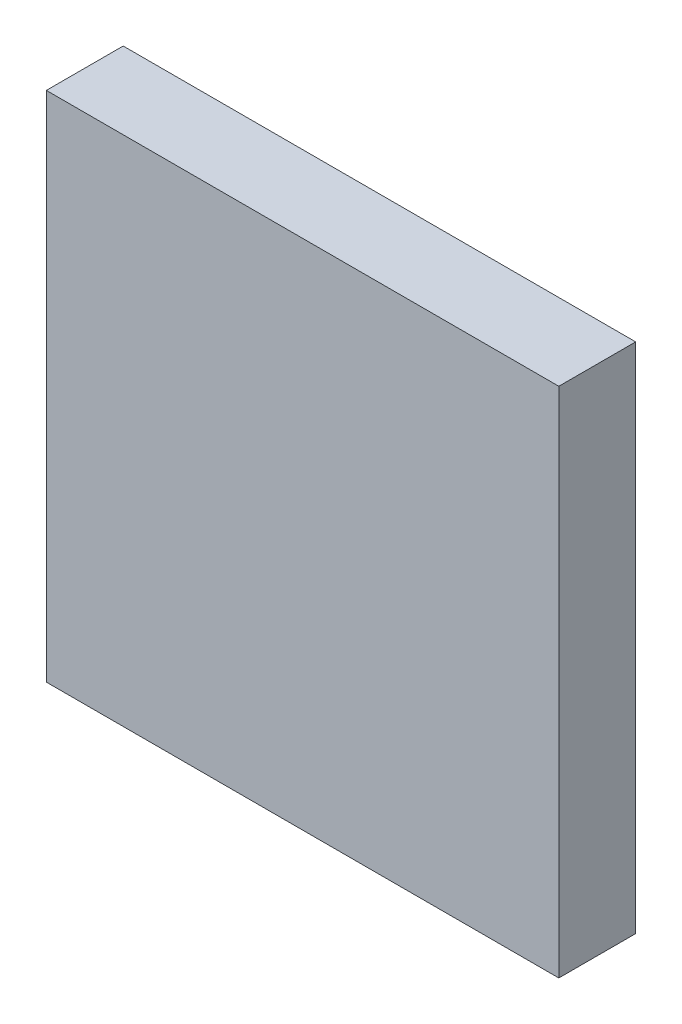
ISO-10303-21;
HEADER;
FILE_DESCRIPTION(('STEP AP214'),'2;1');
FILE_NAME('part.step','',(''),(''),'','','');
FILE_SCHEMA(('AUTOMOTIVE_DESIGN { 1 0 10303 214 1 1 1 1 }'));
ENDSEC;
DATA;
#1=APPLICATION_CONTEXT('core data for automotive mechanical design processes');
#2=APPLICATION_PROTOCOL_DEFINITION('international standard','automotive_design',2000,#1);
#3=PRODUCT_CONTEXT('',#1,'mechanical');
#4=PRODUCT('Part','Part','',(#3));
#5=PRODUCT_RELATED_PRODUCT_CATEGORY('part','',(#4));
#6=PRODUCT_DEFINITION_FORMATION('','',#4);
#7=PRODUCT_DEFINITION_CONTEXT('part definition',#1,'design');
#8=PRODUCT_DEFINITION('design','',#6,#7);
#9=PRODUCT_DEFINITION_SHAPE('','',#8);
#10=(LENGTH_UNIT() NAMED_UNIT(*) SI_UNIT(.MILLI.,.METRE.));
#11=(NAMED_UNIT(*) PLANE_ANGLE_UNIT() SI_UNIT($,.RADIAN.));
#12=(NAMED_UNIT(*) SI_UNIT($,.STERADIAN.) SOLID_ANGLE_UNIT());
#13=UNCERTAINTY_MEASURE_WITH_UNIT(LENGTH_MEASURE(1.E-05),#10,'distance_accuracy_value','');
#14=(GEOMETRIC_REPRESENTATION_CONTEXT(3) GLOBAL_UNCERTAINTY_ASSIGNED_CONTEXT((#13)) GLOBAL_UNIT_ASSIGNED_CONTEXT((#10,
#11,#12)) REPRESENTATION_CONTEXT('',''));
#15=CARTESIAN_POINT('',(0.,0.,0.));
#16=DIRECTION('',(0.,0.,1.));
#17=DIRECTION('',(1.,0.,0.));
#18=AXIS2_PLACEMENT_3D('',#15,#16,#17);
#19=CARTESIAN_POINT('',(0.,0.,6.));
#20=DIRECTION('',(1.,0.,0.));
#21=DIRECTION('',(0.,0.,-1.));
#22=AXIS2_PLACEMENT_3D('',#19,#20,#21);
#23=PLANE('',#22);
#24=DIRECTION('',(0.,-1.,0.));
#25=VECTOR('',#24,1.);
#26=CARTESIAN_POINT('',(0.,0.,0.));
#27=LINE('',#26,#25);
#28=CARTESIAN_POINT('',(0.,40.,0.));
#29=VERTEX_POINT('',#28);
#30=CARTESIAN_POINT('',(0.,0.,0.));
#31=VERTEX_POINT('',#30);
#32=EDGE_CURVE('E100',#29,#31,#27,.T.);
#33=ORIENTED_EDGE('',*,*,#32,.T.);
#34=DIRECTION('',(0.,0.,-1.));
#35=VECTOR('',#34,1.);
#36=CARTESIAN_POINT('',(0.,0.,6.));
#37=LINE('',#36,#35);
#38=CARTESIAN_POINT('',(0.,0.,6.));
#39=VERTEX_POINT('',#38);
#40=EDGE_CURVE('E11',#39,#31,#37,.T.);
#41=ORIENTED_EDGE('',*,*,#40,.F.);
#42=DIRECTION('',(0.,-1.,0.));
#43=VECTOR('',#42,1.);
#44=CARTESIAN_POINT('',(0.,0.,6.));
#45=LINE('',#44,#43);
#46=CARTESIAN_POINT('',(0.,40.,6.));
#47=VERTEX_POINT('',#46);
#48=EDGE_CURVE('E88',#47,#39,#45,.T.);
#49=ORIENTED_EDGE('',*,*,#48,.F.);
#50=DIRECTION('',(0.,0.,-1.));
#51=VECTOR('',#50,1.);
#52=CARTESIAN_POINT('',(0.,40.,6.));
#53=LINE('',#52,#51);
#54=EDGE_CURVE('E96',#47,#29,#53,.T.);
#55=ORIENTED_EDGE('',*,*,#54,.T.);
#56=EDGE_LOOP('',(#33,#41,#49,#55));
#57=FACE_BOUND('',#56,.T.);
#58=ADVANCED_FACE('F37',(#57),#23,.F.);
#59=CARTESIAN_POINT('',(0.,0.,6.));
#60=DIRECTION('',(0.,1.,0.));
#61=DIRECTION('',(0.,0.,1.));
#62=AXIS2_PLACEMENT_3D('',#59,#60,#61);
#63=PLANE('',#62);
#64=DIRECTION('',(1.,0.,0.));
#65=VECTOR('',#64,1.);
#66=CARTESIAN_POINT('',(0.,0.,0.));
#67=LINE('',#66,#65);
#68=CARTESIAN_POINT('',(40.,0.,0.));
#69=VERTEX_POINT('',#68);
#70=EDGE_CURVE('E92',#31,#69,#67,.T.);
#71=ORIENTED_EDGE('',*,*,#70,.T.);
#72=DIRECTION('',(0.,0.,-1.));
#73=VECTOR('',#72,1.);
#74=CARTESIAN_POINT('',(40.,0.,6.));
#75=LINE('',#74,#73);
#76=CARTESIAN_POINT('',(40.,0.,6.));
#77=VERTEX_POINT('',#76);
#78=EDGE_CURVE('E45',#77,#69,#75,.T.);
#79=ORIENTED_EDGE('',*,*,#78,.F.);
#80=DIRECTION('',(1.,0.,0.));
#81=VECTOR('',#80,1.);
#82=CARTESIAN_POINT('',(0.,0.,6.));
#83=LINE('',#82,#81);
#84=EDGE_CURVE('E83',#39,#77,#83,.T.);
#85=ORIENTED_EDGE('',*,*,#84,.F.);
#86=ORIENTED_EDGE('',*,*,#40,.T.);
#87=EDGE_LOOP('',(#71,#79,#85,#86));
#88=FACE_BOUND('',#87,.T.);
#89=ADVANCED_FACE('F91',(#88),#63,.F.);
#90=CARTESIAN_POINT('',(40.,0.,6.));
#91=DIRECTION('',(-1.,0.,0.));
#92=DIRECTION('',(0.,0.,1.));
#93=AXIS2_PLACEMENT_3D('',#90,#91,#92);
#94=PLANE('',#93);
#95=DIRECTION('',(0.,1.,0.));
#96=VECTOR('',#95,1.);
#97=CARTESIAN_POINT('',(40.,0.,0.));
#98=LINE('',#97,#96);
#99=CARTESIAN_POINT('',(40.,40.,0.));
#100=VERTEX_POINT('',#99);
#101=EDGE_CURVE('E70',#69,#100,#98,.T.);
#102=ORIENTED_EDGE('',*,*,#101,.T.);
#103=DIRECTION('',(0.,0.,-1.));
#104=VECTOR('',#103,1.);
#105=CARTESIAN_POINT('',(40.,40.,6.));
#106=LINE('',#105,#104);
#107=CARTESIAN_POINT('',(40.,40.,6.));
#108=VERTEX_POINT('',#107);
#109=EDGE_CURVE('E93',#108,#100,#106,.T.);
#110=ORIENTED_EDGE('',*,*,#109,.F.);
#111=DIRECTION('',(0.,1.,0.));
#112=VECTOR('',#111,1.);
#113=CARTESIAN_POINT('',(40.,0.,6.));
#114=LINE('',#113,#112);
#115=EDGE_CURVE('E86',#77,#108,#114,.T.);
#116=ORIENTED_EDGE('',*,*,#115,.F.);
#117=ORIENTED_EDGE('',*,*,#78,.T.);
#118=EDGE_LOOP('',(#102,#110,#116,#117));
#119=FACE_BOUND('',#118,.T.);
#120=ADVANCED_FACE('F94',(#119),#94,.F.);
#121=CARTESIAN_POINT('',(0.,40.,6.));
#122=DIRECTION('',(0.,-1.,0.));
#123=DIRECTION('',(0.,0.,-1.));
#124=AXIS2_PLACEMENT_3D('',#121,#122,#123);
#125=PLANE('',#124);
#126=DIRECTION('',(-1.,0.,0.));
#127=VECTOR('',#126,1.);
#128=CARTESIAN_POINT('',(0.,40.,0.));
#129=LINE('',#128,#127);
#130=EDGE_CURVE('E76',#100,#29,#129,.T.);
#131=ORIENTED_EDGE('',*,*,#130,.T.);
#132=ORIENTED_EDGE('',*,*,#54,.F.);
#133=DIRECTION('',(-1.,0.,0.));
#134=VECTOR('',#133,1.);
#135=CARTESIAN_POINT('',(0.,40.,6.));
#136=LINE('',#135,#134);
#137=EDGE_CURVE('E53',#108,#47,#136,.T.);
#138=ORIENTED_EDGE('',*,*,#137,.F.);
#139=ORIENTED_EDGE('',*,*,#109,.T.);
#140=EDGE_LOOP('',(#131,#132,#138,#139));
#141=FACE_BOUND('',#140,.T.);
#142=ADVANCED_FACE('F107',(#141),#125,.F.);
#143=CARTESIAN_POINT('',(0.,0.,6.));
#144=DIRECTION('',(0.,0.,-1.));
#145=DIRECTION('',(-1.,0.,0.));
#146=AXIS2_PLACEMENT_3D('',#143,#144,#145);
#147=PLANE('',#146);
#148=ORIENTED_EDGE('',*,*,#48,.T.);
#149=ORIENTED_EDGE('',*,*,#84,.T.);
#150=ORIENTED_EDGE('',*,*,#115,.T.);
#151=ORIENTED_EDGE('',*,*,#137,.T.);
#152=EDGE_LOOP('',(#148,#149,#150,#151));
#153=FACE_BOUND('',#152,.T.);
#154=ADVANCED_FACE('F84',(#153),#147,.F.);
#155=CARTESIAN_POINT('',(0.,0.,0.));
#156=DIRECTION('',(0.,0.,-1.));
#157=DIRECTION('',(-1.,0.,0.));
#158=AXIS2_PLACEMENT_3D('',#155,#156,#157);
#159=PLANE('',#158);
#160=ORIENTED_EDGE('',*,*,#32,.F.);
#161=ORIENTED_EDGE('',*,*,#130,.F.);
#162=ORIENTED_EDGE('',*,*,#101,.F.);
#163=ORIENTED_EDGE('',*,*,#70,.F.);
#164=EDGE_LOOP('',(#160,#161,#162,#163));
#165=FACE_BOUND('',#164,.T.);
#166=ADVANCED_FACE('F110',(#165),#159,.T.);
#167=CLOSED_SHELL('',(#58,#89,#120,#142,#154,#166));
#168=MANIFOLD_SOLID_BREP('B2',#167);
#169=ADVANCED_BREP_SHAPE_REPRESENTATION('',(#18,#168),#14);
#170=SHAPE_DEFINITION_REPRESENTATION(#9,#169);
ENDSEC;
END-ISO-10303-21;
